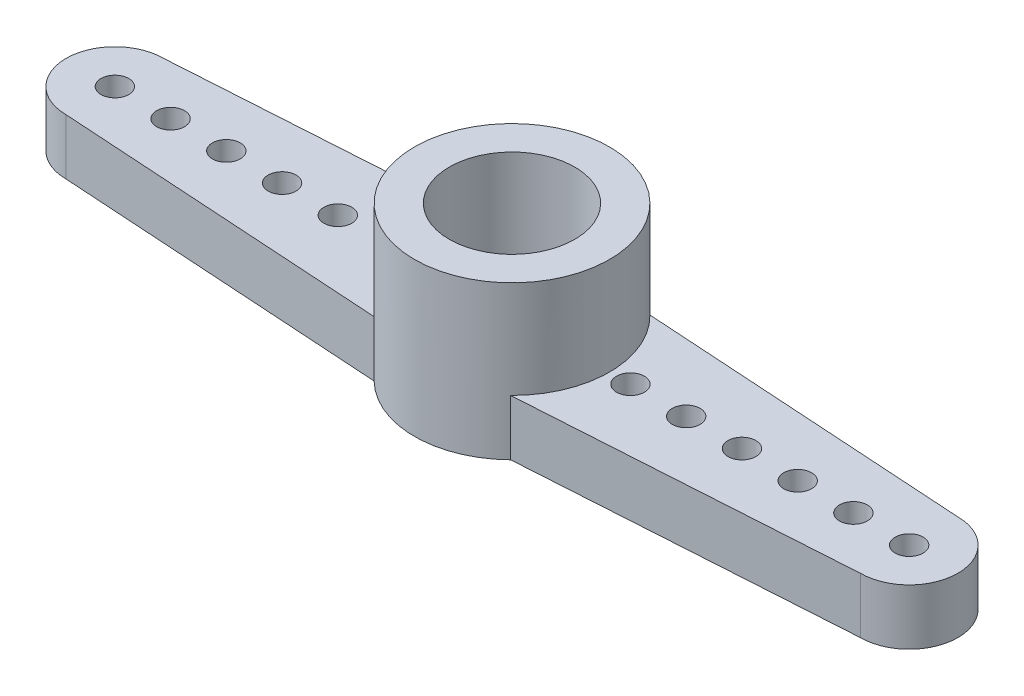
ISO-10303-21;
HEADER;
FILE_DESCRIPTION(('STEP AP214'),'2;1');
FILE_NAME('part.step','',(''),(''),'','','');
FILE_SCHEMA(('AUTOMOTIVE_DESIGN { 1 0 10303 214 1 1 1 1 }'));
ENDSEC;
DATA;
#1=APPLICATION_CONTEXT('core data for automotive mechanical design processes');
#2=APPLICATION_PROTOCOL_DEFINITION('international standard','automotive_design',2000,#1);
#3=PRODUCT_CONTEXT('',#1,'mechanical');
#4=PRODUCT('Part','Part','',(#3));
#5=PRODUCT_RELATED_PRODUCT_CATEGORY('part','',(#4));
#6=PRODUCT_DEFINITION_FORMATION('','',#4);
#7=PRODUCT_DEFINITION_CONTEXT('part definition',#1,'design');
#8=PRODUCT_DEFINITION('design','',#6,#7);
#9=PRODUCT_DEFINITION_SHAPE('','',#8);
#10=(LENGTH_UNIT() NAMED_UNIT(*) SI_UNIT(.MILLI.,.METRE.));
#11=(NAMED_UNIT(*) PLANE_ANGLE_UNIT() SI_UNIT($,.RADIAN.));
#12=(NAMED_UNIT(*) SI_UNIT($,.STERADIAN.) SOLID_ANGLE_UNIT());
#13=UNCERTAINTY_MEASURE_WITH_UNIT(LENGTH_MEASURE(1.E-05),#10,'distance_accuracy_value','');
#14=(GEOMETRIC_REPRESENTATION_CONTEXT(3) GLOBAL_UNCERTAINTY_ASSIGNED_CONTEXT((#13)) GLOBAL_UNIT_ASSIGNED_CONTEXT((#10,
#11,#12)) REPRESENTATION_CONTEXT('',''));
#15=CARTESIAN_POINT('',(0.,0.,0.));
#16=DIRECTION('',(0.,0.,1.));
#17=DIRECTION('',(1.,0.,0.));
#18=AXIS2_PLACEMENT_3D('',#15,#16,#17);
#19=CARTESIAN_POINT('',(14.25,0.,0.));
#20=DIRECTION('',(0.,1.,0.));
#21=DIRECTION('',(0.,0.,1.));
#22=AXIS2_PLACEMENT_3D('',#19,#20,#21);
#23=PLANE('',#22);
#24=CARTESIAN_POINT('',(12.25,0.,0.));
#25=DIRECTION('',(0.,-1.,0.));
#26=DIRECTION('',(0.,0.,-1.));
#27=AXIS2_PLACEMENT_3D('',#24,#25,#26);
#28=CIRCLE('',#27,0.500000000000001);
#29=CARTESIAN_POINT('',(12.25,0.,-0.500000000000015));
#30=VERTEX_POINT('',#29);
#31=EDGE_CURVE('E269',#30,#30,#28,.T.);
#32=ORIENTED_EDGE('',*,*,#31,.F.);
#33=EDGE_LOOP('',(#32));
#34=FACE_BOUND('',#33,.T.);
#35=CARTESIAN_POINT('',(10.25,0.,0.));
#36=DIRECTION('',(0.,-1.,0.));
#37=DIRECTION('',(0.,0.,-1.));
#38=AXIS2_PLACEMENT_3D('',#35,#36,#37);
#39=CIRCLE('',#38,0.500000000000001);
#40=CARTESIAN_POINT('',(10.25,0.,-0.500000000000029));
#41=VERTEX_POINT('',#40);
#42=EDGE_CURVE('E272',#41,#41,#39,.T.);
#43=ORIENTED_EDGE('',*,*,#42,.F.);
#44=EDGE_LOOP('',(#43));
#45=FACE_BOUND('',#44,.T.);
#46=CARTESIAN_POINT('',(8.25,0.,0.));
#47=DIRECTION('',(0.,-1.,0.));
#48=DIRECTION('',(0.,0.,-1.));
#49=AXIS2_PLACEMENT_3D('',#46,#47,#48);
#50=CIRCLE('',#49,0.500000000000001);
#51=CARTESIAN_POINT('',(8.25,0.,-0.500000000000043));
#52=VERTEX_POINT('',#51);
#53=EDGE_CURVE('E261',#52,#52,#50,.T.);
#54=ORIENTED_EDGE('',*,*,#53,.F.);
#55=EDGE_LOOP('',(#54));
#56=FACE_BOUND('',#55,.T.);
#57=CARTESIAN_POINT('',(14.25,0.,0.));
#58=DIRECTION('',(0.,-1.,0.));
#59=DIRECTION('',(0.,0.,-1.));
#60=AXIS2_PLACEMENT_3D('',#57,#58,#59);
#61=CIRCLE('',#60,0.500000000000001);
#62=CARTESIAN_POINT('',(14.25,0.,-0.500000000000001));
#63=VERTEX_POINT('',#62);
#64=EDGE_CURVE('E247',#63,#63,#61,.T.);
#65=ORIENTED_EDGE('',*,*,#64,.F.);
#66=EDGE_LOOP('',(#65));
#67=FACE_BOUND('',#66,.T.);
#68=CARTESIAN_POINT('',(4.25,0.,0.));
#69=DIRECTION('',(0.,-1.,0.));
#70=DIRECTION('',(0.,0.,-1.));
#71=AXIS2_PLACEMENT_3D('',#68,#69,#70);
#72=CIRCLE('',#71,0.500000000000001);
#73=CARTESIAN_POINT('',(4.25,0.,-0.500000000000071));
#74=VERTEX_POINT('',#73);
#75=EDGE_CURVE('E260',#74,#74,#72,.T.);
#76=ORIENTED_EDGE('',*,*,#75,.F.);
#77=EDGE_LOOP('',(#76));
#78=FACE_BOUND('',#77,.T.);
#79=CARTESIAN_POINT('',(6.25,0.,0.));
#80=DIRECTION('',(0.,-1.,0.));
#81=DIRECTION('',(0.,0.,-1.));
#82=AXIS2_PLACEMENT_3D('',#79,#80,#81);
#83=CIRCLE('',#82,0.500000000000001);
#84=CARTESIAN_POINT('',(6.25,0.,-0.500000000000057));
#85=VERTEX_POINT('',#84);
#86=EDGE_CURVE('E257',#85,#85,#83,.T.);
#87=ORIENTED_EDGE('',*,*,#86,.F.);
#88=EDGE_LOOP('',(#87));
#89=FACE_BOUND('',#88,.T.);
#90=CARTESIAN_POINT('',(0.,0.,0.));
#91=DIRECTION('',(0.,-1.,0.));
#92=DIRECTION('',(0.,0.,-1.));
#93=AXIS2_PLACEMENT_3D('',#90,#91,#92);
#94=CIRCLE('',#93,2.5);
#95=CARTESIAN_POINT('',(0.,0.,-2.5));
#96=VERTEX_POINT('',#95);
#97=EDGE_CURVE('E201',#96,#96,#94,.T.);
#98=ORIENTED_EDGE('',*,*,#97,.F.);
#99=EDGE_LOOP('',(#98));
#100=FACE_BOUND('',#99,.T.);
#101=CARTESIAN_POINT('',(14.25,0.,0.));
#102=DIRECTION('',(0.,1.,0.));
#103=DIRECTION('',(0.,0.,1.));
#104=AXIS2_PLACEMENT_3D('',#101,#102,#103);
#105=CIRCLE('',#104,1.75);
#106=CARTESIAN_POINT('',(14.25,0.,1.75));
#107=VERTEX_POINT('',#106);
#108=CARTESIAN_POINT('',(14.25,0.,-1.75));
#109=VERTEX_POINT('',#108);
#110=EDGE_CURVE('E146',#107,#109,#105,.T.);
#111=ORIENTED_EDGE('',*,*,#110,.F.);
#112=DIRECTION('',(0.997986379341568,0.,-0.0634285948820241));
#113=VECTOR('',#112,1.);
#114=CARTESIAN_POINT('',(14.25,0.,1.75));
#115=LINE('',#114,#113);
#116=CARTESIAN_POINT('',(2.44948974278318,0.,2.5));
#117=VERTEX_POINT('',#116);
#118=EDGE_CURVE('E97',#117,#107,#115,.T.);
#119=ORIENTED_EDGE('',*,*,#118,.F.);
#120=CARTESIAN_POINT('',(0.,0.,0.));
#121=DIRECTION('',(0.,1.,0.));
#122=DIRECTION('',(0.,0.,1.));
#123=AXIS2_PLACEMENT_3D('',#120,#121,#122);
#124=CIRCLE('',#123,3.5);
#125=CARTESIAN_POINT('',(-2.44948974278318,0.,2.5));
#126=VERTEX_POINT('',#125);
#127=EDGE_CURVE('E91',#126,#117,#124,.T.);
#128=ORIENTED_EDGE('',*,*,#127,.F.);
#129=DIRECTION('',(0.997986379341568,0.,0.0634285948820241));
#130=VECTOR('',#129,1.);
#131=CARTESIAN_POINT('',(-14.25,0.,1.75));
#132=LINE('',#131,#130);
#133=CARTESIAN_POINT('',(-14.25,0.,1.75));
#134=VERTEX_POINT('',#133);
#135=EDGE_CURVE('E157',#134,#126,#132,.T.);
#136=ORIENTED_EDGE('',*,*,#135,.F.);
#137=CARTESIAN_POINT('',(-14.25,0.,0.));
#138=DIRECTION('',(0.,1.,0.));
#139=DIRECTION('',(0.,0.,1.));
#140=AXIS2_PLACEMENT_3D('',#137,#138,#139);
#141=CIRCLE('',#140,1.75);
#142=CARTESIAN_POINT('',(-14.25,0.,-1.75));
#143=VERTEX_POINT('',#142);
#144=EDGE_CURVE('E134',#143,#134,#141,.T.);
#145=ORIENTED_EDGE('',*,*,#144,.F.);
#146=DIRECTION('',(-0.997986379341568,0.,0.0634285948820241));
#147=VECTOR('',#146,1.);
#148=CARTESIAN_POINT('',(-14.25,0.,-1.75));
#149=LINE('',#148,#147);
#150=CARTESIAN_POINT('',(-2.44948974278318,0.,-2.5));
#151=VERTEX_POINT('',#150);
#152=EDGE_CURVE('E154',#151,#143,#149,.T.);
#153=ORIENTED_EDGE('',*,*,#152,.F.);
#154=CARTESIAN_POINT('',(0.,0.,0.));
#155=DIRECTION('',(0.,1.,0.));
#156=DIRECTION('',(0.,0.,1.));
#157=AXIS2_PLACEMENT_3D('',#154,#155,#156);
#158=CIRCLE('',#157,3.5);
#159=CARTESIAN_POINT('',(2.44948974278318,0.,-2.5));
#160=VERTEX_POINT('',#159);
#161=EDGE_CURVE('E152',#160,#151,#158,.T.);
#162=ORIENTED_EDGE('',*,*,#161,.F.);
#163=DIRECTION('',(-0.997986379341568,0.,-0.0634285948820241));
#164=VECTOR('',#163,1.);
#165=CARTESIAN_POINT('',(14.25,0.,-1.75));
#166=LINE('',#165,#164);
#167=EDGE_CURVE('E149',#109,#160,#166,.T.);
#168=ORIENTED_EDGE('',*,*,#167,.F.);
#169=EDGE_LOOP('',(#111,#119,#128,#136,#145,#153,#162,#168));
#170=FACE_BOUND('',#169,.T.);
#171=CARTESIAN_POINT('',(-4.25,0.,0.));
#172=DIRECTION('',(0.,1.,0.));
#173=DIRECTION('',(0.,0.,1.));
#174=AXIS2_PLACEMENT_3D('',#171,#172,#173);
#175=CIRCLE('',#174,0.500000000000001);
#176=CARTESIAN_POINT('',(-4.25,0.,0.499999999999931));
#177=VERTEX_POINT('',#176);
#178=EDGE_CURVE('E264',#177,#177,#175,.T.);
#179=ORIENTED_EDGE('',*,*,#178,.T.);
#180=EDGE_LOOP('',(#179));
#181=FACE_BOUND('',#180,.T.);
#182=CARTESIAN_POINT('',(-6.25,0.,0.));
#183=DIRECTION('',(0.,1.,0.));
#184=DIRECTION('',(0.,0.,1.));
#185=AXIS2_PLACEMENT_3D('',#182,#183,#184);
#186=CIRCLE('',#185,0.500000000000001);
#187=CARTESIAN_POINT('',(-6.25,0.,0.499999999999945));
#188=VERTEX_POINT('',#187);
#189=EDGE_CURVE('E254',#188,#188,#186,.T.);
#190=ORIENTED_EDGE('',*,*,#189,.T.);
#191=EDGE_LOOP('',(#190));
#192=FACE_BOUND('',#191,.T.);
#193=CARTESIAN_POINT('',(-12.25,0.,0.));
#194=DIRECTION('',(0.,1.,0.));
#195=DIRECTION('',(0.,0.,1.));
#196=AXIS2_PLACEMENT_3D('',#193,#194,#195);
#197=CIRCLE('',#196,0.500000000000001);
#198=CARTESIAN_POINT('',(-12.25,0.,0.499999999999987));
#199=VERTEX_POINT('',#198);
#200=EDGE_CURVE('E244',#199,#199,#197,.T.);
#201=ORIENTED_EDGE('',*,*,#200,.T.);
#202=EDGE_LOOP('',(#201));
#203=FACE_BOUND('',#202,.T.);
#204=CARTESIAN_POINT('',(-10.25,0.,0.));
#205=DIRECTION('',(0.,1.,0.));
#206=DIRECTION('',(0.,0.,1.));
#207=AXIS2_PLACEMENT_3D('',#204,#205,#206);
#208=CIRCLE('',#207,0.500000000000001);
#209=CARTESIAN_POINT('',(-10.25,0.,0.499999999999973));
#210=VERTEX_POINT('',#209);
#211=EDGE_CURVE('E248',#210,#210,#208,.T.);
#212=ORIENTED_EDGE('',*,*,#211,.T.);
#213=EDGE_LOOP('',(#212));
#214=FACE_BOUND('',#213,.T.);
#215=CARTESIAN_POINT('',(-8.25,0.,0.));
#216=DIRECTION('',(0.,1.,0.));
#217=DIRECTION('',(0.,0.,1.));
#218=AXIS2_PLACEMENT_3D('',#215,#216,#217);
#219=CIRCLE('',#218,0.500000000000001);
#220=CARTESIAN_POINT('',(-8.25,0.,0.499999999999959));
#221=VERTEX_POINT('',#220);
#222=EDGE_CURVE('E251',#221,#221,#219,.T.);
#223=ORIENTED_EDGE('',*,*,#222,.T.);
#224=EDGE_LOOP('',(#223));
#225=FACE_BOUND('',#224,.T.);
#226=CARTESIAN_POINT('',(-14.25,0.,0.));
#227=DIRECTION('',(0.,-1.,0.));
#228=DIRECTION('',(0.,0.,-1.));
#229=AXIS2_PLACEMENT_3D('',#226,#227,#228);
#230=CIRCLE('',#229,0.500000000000001);
#231=CARTESIAN_POINT('',(-14.25,0.,-0.500000000000001));
#232=VERTEX_POINT('',#231);
#233=EDGE_CURVE('E243',#232,#232,#230,.F.);
#234=ORIENTED_EDGE('',*,*,#233,.T.);
#235=EDGE_LOOP('',(#234));
#236=FACE_BOUND('',#235,.T.);
#237=ADVANCED_FACE('F40',(#34,#45,#56,#67,#78,#89,#100,#170,#181,#192,#203,#214,#225,#236),#23,.F.);
#238=CARTESIAN_POINT('',(0.,-3.,0.));
#239=DIRECTION('',(0.,1.,0.));
#240=DIRECTION('',(0.,0.,1.));
#241=AXIS2_PLACEMENT_3D('',#238,#239,#240);
#242=CYLINDRICAL_SURFACE('',#241,1.25);
#243=CARTESIAN_POINT('',(0.,2.,0.));
#244=DIRECTION('',(0.,1.,0.));
#245=DIRECTION('',(0.,0.,1.));
#246=AXIS2_PLACEMENT_3D('',#243,#244,#245);
#247=CIRCLE('',#246,1.25);
#248=CARTESIAN_POINT('',(0.,2.,1.25));
#249=VERTEX_POINT('',#248);
#250=EDGE_CURVE('E196',#249,#249,#247,.T.);
#251=ORIENTED_EDGE('',*,*,#250,.T.);
#252=EDGE_LOOP('',(#251));
#253=FACE_BOUND('',#252,.T.);
#254=CARTESIAN_POINT('',(0.,1.,0.));
#255=DIRECTION('',(0.,-1.,0.));
#256=DIRECTION('',(0.,0.,-1.));
#257=AXIS2_PLACEMENT_3D('',#254,#255,#256);
#258=CIRCLE('',#257,1.25);
#259=CARTESIAN_POINT('',(0.,1.,-1.25));
#260=VERTEX_POINT('',#259);
#261=EDGE_CURVE('E44',#260,#260,#258,.F.);
#262=ORIENTED_EDGE('',*,*,#261,.F.);
#263=EDGE_LOOP('',(#262));
#264=FACE_BOUND('',#263,.T.);
#265=ADVANCED_FACE('F295',(#253,#264),#242,.F.);
#266=CARTESIAN_POINT('',(14.25,2.,0.));
#267=DIRECTION('',(0.,1.,0.));
#268=DIRECTION('',(0.,0.,1.));
#269=AXIS2_PLACEMENT_3D('',#266,#267,#268);
#270=PLANE('',#269);
#271=CARTESIAN_POINT('',(12.25,2.,0.));
#272=DIRECTION('',(0.,1.,0.));
#273=DIRECTION('',(0.,0.,1.));
#274=AXIS2_PLACEMENT_3D('',#271,#272,#273);
#275=CIRCLE('',#274,0.500000000000001);
#276=CARTESIAN_POINT('',(12.25,2.,0.499999999999987));
#277=VERTEX_POINT('',#276);
#278=EDGE_CURVE('E210',#277,#277,#275,.T.);
#279=ORIENTED_EDGE('',*,*,#278,.F.);
#280=EDGE_LOOP('',(#279));
#281=FACE_BOUND('',#280,.T.);
#282=CARTESIAN_POINT('',(10.25,2.,0.));
#283=DIRECTION('',(0.,1.,0.));
#284=DIRECTION('',(0.,0.,1.));
#285=AXIS2_PLACEMENT_3D('',#282,#283,#284);
#286=CIRCLE('',#285,0.500000000000001);
#287=CARTESIAN_POINT('',(10.25,2.,0.499999999999973));
#288=VERTEX_POINT('',#287);
#289=EDGE_CURVE('E213',#288,#288,#286,.T.);
#290=ORIENTED_EDGE('',*,*,#289,.F.);
#291=EDGE_LOOP('',(#290));
#292=FACE_BOUND('',#291,.T.);
#293=CARTESIAN_POINT('',(8.25,2.,0.));
#294=DIRECTION('',(0.,1.,0.));
#295=DIRECTION('',(0.,0.,1.));
#296=AXIS2_PLACEMENT_3D('',#293,#294,#295);
#297=CIRCLE('',#296,0.500000000000001);
#298=CARTESIAN_POINT('',(8.25,2.,0.499999999999959));
#299=VERTEX_POINT('',#298);
#300=EDGE_CURVE('E216',#299,#299,#297,.T.);
#301=ORIENTED_EDGE('',*,*,#300,.F.);
#302=EDGE_LOOP('',(#301));
#303=FACE_BOUND('',#302,.T.);
#304=CARTESIAN_POINT('',(14.25,2.,0.));
#305=DIRECTION('',(0.,1.,0.));
#306=DIRECTION('',(0.,0.,1.));
#307=AXIS2_PLACEMENT_3D('',#304,#305,#306);
#308=CIRCLE('',#307,0.500000000000001);
#309=CARTESIAN_POINT('',(14.25,2.,0.500000000000001));
#310=VERTEX_POINT('',#309);
#311=EDGE_CURVE('E228',#310,#310,#308,.T.);
#312=ORIENTED_EDGE('',*,*,#311,.F.);
#313=EDGE_LOOP('',(#312));
#314=FACE_BOUND('',#313,.T.);
#315=CARTESIAN_POINT('',(4.25,2.,0.));
#316=DIRECTION('',(0.,1.,0.));
#317=DIRECTION('',(0.,0.,1.));
#318=AXIS2_PLACEMENT_3D('',#315,#316,#317);
#319=CIRCLE('',#318,0.500000000000001);
#320=CARTESIAN_POINT('',(4.25,2.,0.499999999999931));
#321=VERTEX_POINT('',#320);
#322=EDGE_CURVE('E237',#321,#321,#319,.T.);
#323=ORIENTED_EDGE('',*,*,#322,.F.);
#324=EDGE_LOOP('',(#323));
#325=FACE_BOUND('',#324,.T.);
#326=CARTESIAN_POINT('',(6.25,2.,0.));
#327=DIRECTION('',(0.,1.,0.));
#328=DIRECTION('',(0.,0.,1.));
#329=AXIS2_PLACEMENT_3D('',#326,#327,#328);
#330=CIRCLE('',#329,0.500000000000001);
#331=CARTESIAN_POINT('',(6.25,2.,0.499999999999945));
#332=VERTEX_POINT('',#331);
#333=EDGE_CURVE('E240',#332,#332,#330,.T.);
#334=ORIENTED_EDGE('',*,*,#333,.F.);
#335=EDGE_LOOP('',(#334));
#336=FACE_BOUND('',#335,.T.);
#337=CARTESIAN_POINT('',(0.,2.,0.));
#338=DIRECTION('',(0.,1.,0.));
#339=DIRECTION('',(0.,0.,1.));
#340=AXIS2_PLACEMENT_3D('',#337,#338,#339);
#341=CIRCLE('',#340,3.5);
#342=CARTESIAN_POINT('',(2.44948974278318,2.,2.5));
#343=VERTEX_POINT('',#342);
#344=CARTESIAN_POINT('',(2.44948974278318,2.,-2.5));
#345=VERTEX_POINT('',#344);
#346=EDGE_CURVE('E52',#343,#345,#341,.T.);
#347=ORIENTED_EDGE('',*,*,#346,.F.);
#348=DIRECTION('',(0.997986379341568,0.,-0.0634285948820241));
#349=VECTOR('',#348,1.);
#350=CARTESIAN_POINT('',(14.25,2.,1.75));
#351=LINE('',#350,#349);
#352=CARTESIAN_POINT('',(14.25,2.,1.75));
#353=VERTEX_POINT('',#352);
#354=EDGE_CURVE('E60',#343,#353,#351,.T.);
#355=ORIENTED_EDGE('',*,*,#354,.T.);
#356=CARTESIAN_POINT('',(14.25,2.,0.));
#357=DIRECTION('',(0.,1.,0.));
#358=DIRECTION('',(0.,0.,1.));
#359=AXIS2_PLACEMENT_3D('',#356,#357,#358);
#360=CIRCLE('',#359,1.75);
#361=CARTESIAN_POINT('',(14.25,2.,-1.75));
#362=VERTEX_POINT('',#361);
#363=EDGE_CURVE('E161',#353,#362,#360,.T.);
#364=ORIENTED_EDGE('',*,*,#363,.T.);
#365=DIRECTION('',(-0.997986379341568,0.,-0.0634285948820241));
#366=VECTOR('',#365,1.);
#367=CARTESIAN_POINT('',(14.25,2.,-1.75));
#368=LINE('',#367,#366);
#369=EDGE_CURVE('E106',#362,#345,#368,.T.);
#370=ORIENTED_EDGE('',*,*,#369,.T.);
#371=EDGE_LOOP('',(#347,#355,#364,#370));
#372=FACE_BOUND('',#371,.T.);
#373=ADVANCED_FACE('F301',(#281,#292,#303,#314,#325,#336,#372),#270,.T.);
#374=CARTESIAN_POINT('',(14.25,2.,0.));
#375=DIRECTION('',(0.,-1.,0.));
#376=DIRECTION('',(0.,0.,-1.));
#377=AXIS2_PLACEMENT_3D('',#374,#375,#376);
#378=CYLINDRICAL_SURFACE('',#377,1.75);
#379=ORIENTED_EDGE('',*,*,#110,.T.);
#380=DIRECTION('',(0.,-1.,0.));
#381=VECTOR('',#380,1.);
#382=CARTESIAN_POINT('',(14.25,2.,-1.75));
#383=LINE('',#382,#381);
#384=EDGE_CURVE('E50',#362,#109,#383,.T.);
#385=ORIENTED_EDGE('',*,*,#384,.F.);
#386=ORIENTED_EDGE('',*,*,#363,.F.);
#387=DIRECTION('',(0.,-1.,0.));
#388=VECTOR('',#387,1.);
#389=CARTESIAN_POINT('',(14.25,2.,1.75));
#390=LINE('',#389,#388);
#391=EDGE_CURVE('E142',#353,#107,#390,.T.);
#392=ORIENTED_EDGE('',*,*,#391,.T.);
#393=EDGE_LOOP('',(#379,#385,#386,#392));
#394=FACE_BOUND('',#393,.T.);
#395=ADVANCED_FACE('F42',(#394),#378,.T.);
#396=CARTESIAN_POINT('',(14.25,2.,-1.75));
#397=DIRECTION('',(-0.0634285948820241,0.,0.997986379341568));
#398=DIRECTION('',(0.997986379341568,0.,0.0634285948820241));
#399=AXIS2_PLACEMENT_3D('',#396,#397,#398);
#400=PLANE('',#399);
#401=ORIENTED_EDGE('',*,*,#167,.T.);
#402=DIRECTION('',(0.,-1.,0.));
#403=VECTOR('',#402,1.);
#404=CARTESIAN_POINT('',(2.44948974278318,2.,-2.5));
#405=LINE('',#404,#403);
#406=EDGE_CURVE('E170',#345,#160,#405,.T.);
#407=ORIENTED_EDGE('',*,*,#406,.F.);
#408=ORIENTED_EDGE('',*,*,#369,.F.);
#409=ORIENTED_EDGE('',*,*,#384,.T.);
#410=EDGE_LOOP('',(#401,#407,#408,#409));
#411=FACE_BOUND('',#410,.T.);
#412=ADVANCED_FACE('F173',(#411),#400,.F.);
#413=CARTESIAN_POINT('',(-14.25,2.,-1.75));
#414=DIRECTION('',(0.0634285948820241,0.,0.997986379341568));
#415=DIRECTION('',(0.997986379341568,0.,-0.0634285948820241));
#416=AXIS2_PLACEMENT_3D('',#413,#414,#415);
#417=PLANE('',#416);
#418=ORIENTED_EDGE('',*,*,#152,.T.);
#419=DIRECTION('',(0.,-1.,0.));
#420=VECTOR('',#419,1.);
#421=CARTESIAN_POINT('',(-14.25,2.,-1.75));
#422=LINE('',#421,#420);
#423=CARTESIAN_POINT('',(-14.25,2.,-1.75));
#424=VERTEX_POINT('',#423);
#425=EDGE_CURVE('E137',#424,#143,#422,.T.);
#426=ORIENTED_EDGE('',*,*,#425,.F.);
#427=DIRECTION('',(-0.997986379341568,0.,0.0634285948820241));
#428=VECTOR('',#427,1.);
#429=CARTESIAN_POINT('',(-14.25,2.,-1.75));
#430=LINE('',#429,#428);
#431=CARTESIAN_POINT('',(-2.44948974278318,2.,-2.5));
#432=VERTEX_POINT('',#431);
#433=EDGE_CURVE('E125',#432,#424,#430,.T.);
#434=ORIENTED_EDGE('',*,*,#433,.F.);
#435=DIRECTION('',(0.,-1.,0.));
#436=VECTOR('',#435,1.);
#437=CARTESIAN_POINT('',(-2.44948974278318,2.,-2.5));
#438=LINE('',#437,#436);
#439=EDGE_CURVE('E167',#432,#151,#438,.T.);
#440=ORIENTED_EDGE('',*,*,#439,.T.);
#441=EDGE_LOOP('',(#418,#426,#434,#440));
#442=FACE_BOUND('',#441,.T.);
#443=ADVANCED_FACE('F186',(#442),#417,.F.);
#444=CARTESIAN_POINT('',(-14.25,2.,0.));
#445=DIRECTION('',(0.,-1.,0.));
#446=DIRECTION('',(0.,0.,-1.));
#447=AXIS2_PLACEMENT_3D('',#444,#445,#446);
#448=CYLINDRICAL_SURFACE('',#447,1.75);
#449=ORIENTED_EDGE('',*,*,#144,.T.);
#450=DIRECTION('',(0.,-1.,0.));
#451=VECTOR('',#450,1.);
#452=CARTESIAN_POINT('',(-14.25,2.,1.75));
#453=LINE('',#452,#451);
#454=CARTESIAN_POINT('',(-14.25,2.,1.75));
#455=VERTEX_POINT('',#454);
#456=EDGE_CURVE('E131',#455,#134,#453,.T.);
#457=ORIENTED_EDGE('',*,*,#456,.F.);
#458=CARTESIAN_POINT('',(-14.25,2.,0.));
#459=DIRECTION('',(0.,1.,0.));
#460=DIRECTION('',(0.,0.,1.));
#461=AXIS2_PLACEMENT_3D('',#458,#459,#460);
#462=CIRCLE('',#461,1.75);
#463=EDGE_CURVE('E118',#424,#455,#462,.T.);
#464=ORIENTED_EDGE('',*,*,#463,.F.);
#465=ORIENTED_EDGE('',*,*,#425,.T.);
#466=EDGE_LOOP('',(#449,#457,#464,#465));
#467=FACE_BOUND('',#466,.T.);
#468=ADVANCED_FACE('F132',(#467),#448,.T.);
#469=CARTESIAN_POINT('',(-14.25,2.,1.75));
#470=DIRECTION('',(0.0634285948820241,0.,-0.997986379341568));
#471=DIRECTION('',(-0.997986379341568,0.,-0.0634285948820241));
#472=AXIS2_PLACEMENT_3D('',#469,#470,#471);
#473=PLANE('',#472);
#474=ORIENTED_EDGE('',*,*,#135,.T.);
#475=DIRECTION('',(0.,-1.,0.));
#476=VECTOR('',#475,1.);
#477=CARTESIAN_POINT('',(-2.44948974278318,2.,2.5));
#478=LINE('',#477,#476);
#479=CARTESIAN_POINT('',(-2.44948974278318,2.,2.5));
#480=VERTEX_POINT('',#479);
#481=EDGE_CURVE('E138',#480,#126,#478,.T.);
#482=ORIENTED_EDGE('',*,*,#481,.F.);
#483=DIRECTION('',(0.997986379341568,0.,0.0634285948820241));
#484=VECTOR('',#483,1.);
#485=CARTESIAN_POINT('',(-14.25,2.,1.75));
#486=LINE('',#485,#484);
#487=EDGE_CURVE('E122',#455,#480,#486,.T.);
#488=ORIENTED_EDGE('',*,*,#487,.F.);
#489=ORIENTED_EDGE('',*,*,#456,.T.);
#490=EDGE_LOOP('',(#474,#482,#488,#489));
#491=FACE_BOUND('',#490,.T.);
#492=ADVANCED_FACE('F140',(#491),#473,.F.);
#493=CARTESIAN_POINT('',(0.,2.,0.));
#494=DIRECTION('',(0.,-1.,0.));
#495=DIRECTION('',(0.,0.,-1.));
#496=AXIS2_PLACEMENT_3D('',#493,#494,#495);
#497=CYLINDRICAL_SURFACE('',#496,3.5);
#498=ORIENTED_EDGE('',*,*,#127,.T.);
#499=DIRECTION('',(0.,-1.,0.));
#500=VECTOR('',#499,1.);
#501=CARTESIAN_POINT('',(2.44948974278318,2.,2.5));
#502=LINE('',#501,#500);
#503=EDGE_CURVE('E163',#343,#117,#502,.T.);
#504=ORIENTED_EDGE('',*,*,#503,.F.);
#505=ORIENTED_EDGE('',*,*,#346,.T.);
#506=ORIENTED_EDGE('',*,*,#406,.T.);
#507=ORIENTED_EDGE('',*,*,#161,.T.);
#508=ORIENTED_EDGE('',*,*,#439,.F.);
#509=EDGE_CURVE('E11',#432,#480,#341,.T.);
#510=ORIENTED_EDGE('',*,*,#509,.T.);
#511=ORIENTED_EDGE('',*,*,#481,.T.);
#512=EDGE_LOOP('',(#498,#504,#505,#506,#507,#508,#510,#511));
#513=FACE_BOUND('',#512,.T.);
#514=CARTESIAN_POINT('',(0.,5.5,0.));
#515=DIRECTION('',(0.,1.,0.));
#516=DIRECTION('',(0.,0.,1.));
#517=AXIS2_PLACEMENT_3D('',#514,#515,#516);
#518=CIRCLE('',#517,3.5);
#519=CARTESIAN_POINT('',(0.,5.5,3.5));
#520=VERTEX_POINT('',#519);
#521=EDGE_CURVE('E150',#520,#520,#518,.T.);
#522=ORIENTED_EDGE('',*,*,#521,.F.);
#523=EDGE_LOOP('',(#522));
#524=FACE_BOUND('',#523,.T.);
#525=ADVANCED_FACE('F182',(#513,#524),#497,.T.);
#526=CARTESIAN_POINT('',(14.25,2.,1.75));
#527=DIRECTION('',(-0.0634285948820241,0.,-0.997986379341568));
#528=DIRECTION('',(-0.997986379341568,0.,0.0634285948820241));
#529=AXIS2_PLACEMENT_3D('',#526,#527,#528);
#530=PLANE('',#529);
#531=ORIENTED_EDGE('',*,*,#118,.T.);
#532=ORIENTED_EDGE('',*,*,#391,.F.);
#533=ORIENTED_EDGE('',*,*,#354,.F.);
#534=ORIENTED_EDGE('',*,*,#503,.T.);
#535=EDGE_LOOP('',(#531,#532,#533,#534));
#536=FACE_BOUND('',#535,.T.);
#537=ADVANCED_FACE('F309',(#536),#530,.F.);
#538=CARTESIAN_POINT('',(-14.25,2.,0.));
#539=DIRECTION('',(0.,1.,0.));
#540=DIRECTION('',(0.,0.,1.));
#541=AXIS2_PLACEMENT_3D('',#538,#539,#540);
#542=CIRCLE('',#541,0.500000000000001);
#543=CARTESIAN_POINT('',(-14.25,2.,0.500000000000001));
#544=VERTEX_POINT('',#543);
#545=EDGE_CURVE('E205',#544,#544,#542,.F.);
#546=ORIENTED_EDGE('',*,*,#545,.T.);
#547=EDGE_LOOP('',(#546));
#548=FACE_BOUND('',#547,.T.);
#549=CARTESIAN_POINT('',(-8.25,2.,0.));
#550=DIRECTION('',(0.,1.,0.));
#551=DIRECTION('',(0.,0.,1.));
#552=AXIS2_PLACEMENT_3D('',#549,#550,#551);
#553=CIRCLE('',#552,0.500000000000001);
#554=CARTESIAN_POINT('',(-8.25,2.,0.499999999999959));
#555=VERTEX_POINT('',#554);
#556=EDGE_CURVE('E219',#555,#555,#553,.F.);
#557=ORIENTED_EDGE('',*,*,#556,.T.);
#558=EDGE_LOOP('',(#557));
#559=FACE_BOUND('',#558,.T.);
#560=CARTESIAN_POINT('',(-10.25,2.,0.));
#561=DIRECTION('',(0.,1.,0.));
#562=DIRECTION('',(0.,0.,1.));
#563=AXIS2_PLACEMENT_3D('',#560,#561,#562);
#564=CIRCLE('',#563,0.500000000000001);
#565=CARTESIAN_POINT('',(-10.25,2.,0.499999999999973));
#566=VERTEX_POINT('',#565);
#567=EDGE_CURVE('E222',#566,#566,#564,.F.);
#568=ORIENTED_EDGE('',*,*,#567,.T.);
#569=EDGE_LOOP('',(#568));
#570=FACE_BOUND('',#569,.T.);
#571=CARTESIAN_POINT('',(-12.25,2.,0.));
#572=DIRECTION('',(0.,1.,0.));
#573=DIRECTION('',(0.,0.,1.));
#574=AXIS2_PLACEMENT_3D('',#571,#572,#573);
#575=CIRCLE('',#574,0.500000000000001);
#576=CARTESIAN_POINT('',(-12.25,2.,0.499999999999987));
#577=VERTEX_POINT('',#576);
#578=EDGE_CURVE('E225',#577,#577,#575,.F.);
#579=ORIENTED_EDGE('',*,*,#578,.T.);
#580=EDGE_LOOP('',(#579));
#581=FACE_BOUND('',#580,.T.);
#582=CARTESIAN_POINT('',(-6.25,2.,0.));
#583=DIRECTION('',(0.,1.,0.));
#584=DIRECTION('',(0.,0.,1.));
#585=AXIS2_PLACEMENT_3D('',#582,#583,#584);
#586=CIRCLE('',#585,0.500000000000001);
#587=CARTESIAN_POINT('',(-6.25,2.,0.499999999999945));
#588=VERTEX_POINT('',#587);
#589=EDGE_CURVE('E231',#588,#588,#586,.F.);
#590=ORIENTED_EDGE('',*,*,#589,.T.);
#591=EDGE_LOOP('',(#590));
#592=FACE_BOUND('',#591,.T.);
#593=CARTESIAN_POINT('',(-4.25,2.,0.));
#594=DIRECTION('',(0.,1.,0.));
#595=DIRECTION('',(0.,0.,1.));
#596=AXIS2_PLACEMENT_3D('',#593,#594,#595);
#597=CIRCLE('',#596,0.500000000000001);
#598=CARTESIAN_POINT('',(-4.25,2.,0.499999999999931));
#599=VERTEX_POINT('',#598);
#600=EDGE_CURVE('E234',#599,#599,#597,.F.);
#601=ORIENTED_EDGE('',*,*,#600,.T.);
#602=EDGE_LOOP('',(#601));
#603=FACE_BOUND('',#602,.T.);
#604=ORIENTED_EDGE('',*,*,#509,.F.);
#605=ORIENTED_EDGE('',*,*,#433,.T.);
#606=ORIENTED_EDGE('',*,*,#463,.T.);
#607=ORIENTED_EDGE('',*,*,#487,.T.);
#608=EDGE_LOOP('',(#604,#605,#606,#607));
#609=FACE_BOUND('',#608,.T.);
#610=ADVANCED_FACE('F120',(#548,#559,#570,#581,#592,#603,#609),#270,.T.);
#611=CARTESIAN_POINT('',(0.,5.5,0.));
#612=DIRECTION('',(0.,1.,0.));
#613=DIRECTION('',(0.,0.,1.));
#614=AXIS2_PLACEMENT_3D('',#611,#612,#613);
#615=PLANE('',#614);
#616=ORIENTED_EDGE('',*,*,#521,.T.);
#617=EDGE_LOOP('',(#616));
#618=FACE_BOUND('',#617,.T.);
#619=CARTESIAN_POINT('',(0.,5.5,0.));
#620=DIRECTION('',(0.,1.,0.));
#621=DIRECTION('',(0.,0.,1.));
#622=AXIS2_PLACEMENT_3D('',#619,#620,#621);
#623=CIRCLE('',#622,2.25);
#624=CARTESIAN_POINT('',(0.,5.5,2.25));
#625=VERTEX_POINT('',#624);
#626=EDGE_CURVE('E190',#625,#625,#623,.T.);
#627=ORIENTED_EDGE('',*,*,#626,.F.);
#628=EDGE_LOOP('',(#627));
#629=FACE_BOUND('',#628,.T.);
#630=ADVANCED_FACE('F337',(#618,#629),#615,.T.);
#631=CARTESIAN_POINT('',(0.,5.5,0.));
#632=DIRECTION('',(0.,-1.,0.));
#633=DIRECTION('',(0.,0.,-1.));
#634=AXIS2_PLACEMENT_3D('',#631,#632,#633);
#635=CYLINDRICAL_SURFACE('',#634,2.25);
#636=ORIENTED_EDGE('',*,*,#626,.T.);
#637=EDGE_LOOP('',(#636));
#638=FACE_BOUND('',#637,.T.);
#639=CARTESIAN_POINT('',(0.,2.,0.));
#640=DIRECTION('',(0.,1.,0.));
#641=DIRECTION('',(0.,0.,1.));
#642=AXIS2_PLACEMENT_3D('',#639,#640,#641);
#643=CIRCLE('',#642,2.25);
#644=CARTESIAN_POINT('',(0.,2.,2.25));
#645=VERTEX_POINT('',#644);
#646=EDGE_CURVE('E193',#645,#645,#643,.T.);
#647=ORIENTED_EDGE('',*,*,#646,.F.);
#648=EDGE_LOOP('',(#647));
#649=FACE_BOUND('',#648,.T.);
#650=ADVANCED_FACE('F334',(#638,#649),#635,.F.);
#651=ORIENTED_EDGE('',*,*,#250,.F.);
#652=EDGE_LOOP('',(#651));
#653=FACE_BOUND('',#652,.T.);
#654=ORIENTED_EDGE('',*,*,#646,.T.);
#655=EDGE_LOOP('',(#654));
#656=FACE_BOUND('',#655,.T.);
#657=ADVANCED_FACE('F327',(#653,#656),#270,.T.);
#658=CARTESIAN_POINT('',(0.,1.,0.));
#659=DIRECTION('',(0.,-1.,0.));
#660=DIRECTION('',(0.,0.,-1.));
#661=AXIS2_PLACEMENT_3D('',#658,#659,#660);
#662=PLANE('',#661);
#663=CARTESIAN_POINT('',(0.,1.,0.));
#664=DIRECTION('',(0.,-1.,0.));
#665=DIRECTION('',(0.,0.,-1.));
#666=AXIS2_PLACEMENT_3D('',#663,#664,#665);
#667=CIRCLE('',#666,2.5);
#668=CARTESIAN_POINT('',(0.,1.,-2.5));
#669=VERTEX_POINT('',#668);
#670=EDGE_CURVE('E204',#669,#669,#667,.T.);
#671=ORIENTED_EDGE('',*,*,#670,.T.);
#672=EDGE_LOOP('',(#671));
#673=FACE_BOUND('',#672,.T.);
#674=ORIENTED_EDGE('',*,*,#261,.T.);
#675=EDGE_LOOP('',(#674));
#676=FACE_BOUND('',#675,.T.);
#677=ADVANCED_FACE('F333',(#673,#676),#662,.T.);
#678=CARTESIAN_POINT('',(0.,1.,0.));
#679=DIRECTION('',(0.,-1.,0.));
#680=DIRECTION('',(0.,0.,-1.));
#681=AXIS2_PLACEMENT_3D('',#678,#679,#680);
#682=CYLINDRICAL_SURFACE('',#681,2.5);
#683=ORIENTED_EDGE('',*,*,#670,.F.);
#684=EDGE_LOOP('',(#683));
#685=FACE_BOUND('',#684,.T.);
#686=ORIENTED_EDGE('',*,*,#97,.T.);
#687=EDGE_LOOP('',(#686));
#688=FACE_BOUND('',#687,.T.);
#689=ADVANCED_FACE('F395',(#685,#688),#682,.F.);
#690=CARTESIAN_POINT('',(6.25,5.,0.));
#691=DIRECTION('',(0.,-1.,0.));
#692=DIRECTION('',(0.,0.,-1.));
#693=AXIS2_PLACEMENT_3D('',#690,#691,#692);
#694=CYLINDRICAL_SURFACE('',#693,0.500000000000001);
#695=ORIENTED_EDGE('',*,*,#333,.T.);
#696=EDGE_LOOP('',(#695));
#697=FACE_BOUND('',#696,.T.);
#698=ORIENTED_EDGE('',*,*,#86,.T.);
#699=EDGE_LOOP('',(#698));
#700=FACE_BOUND('',#699,.T.);
#701=ADVANCED_FACE('F398',(#697,#700),#694,.F.);
#702=CARTESIAN_POINT('',(4.25,5.,0.));
#703=DIRECTION('',(0.,-1.,0.));
#704=DIRECTION('',(0.,0.,-1.));
#705=AXIS2_PLACEMENT_3D('',#702,#703,#704);
#706=CYLINDRICAL_SURFACE('',#705,0.500000000000001);
#707=ORIENTED_EDGE('',*,*,#322,.T.);
#708=EDGE_LOOP('',(#707));
#709=FACE_BOUND('',#708,.T.);
#710=ORIENTED_EDGE('',*,*,#75,.T.);
#711=EDGE_LOOP('',(#710));
#712=FACE_BOUND('',#711,.T.);
#713=ADVANCED_FACE('F358',(#709,#712),#706,.F.);
#714=CARTESIAN_POINT('',(-4.25,5.,0.));
#715=DIRECTION('',(0.,-1.,0.));
#716=DIRECTION('',(0.,0.,-1.));
#717=AXIS2_PLACEMENT_3D('',#714,#715,#716);
#718=CYLINDRICAL_SURFACE('',#717,0.500000000000001);
#719=ORIENTED_EDGE('',*,*,#600,.F.);
#720=EDGE_LOOP('',(#719));
#721=FACE_BOUND('',#720,.T.);
#722=ORIENTED_EDGE('',*,*,#178,.F.);
#723=EDGE_LOOP('',(#722));
#724=FACE_BOUND('',#723,.T.);
#725=ADVANCED_FACE('F354',(#721,#724),#718,.F.);
#726=CARTESIAN_POINT('',(-6.25,5.,0.));
#727=DIRECTION('',(0.,-1.,0.));
#728=DIRECTION('',(0.,0.,-1.));
#729=AXIS2_PLACEMENT_3D('',#726,#727,#728);
#730=CYLINDRICAL_SURFACE('',#729,0.500000000000001);
#731=ORIENTED_EDGE('',*,*,#589,.F.);
#732=EDGE_LOOP('',(#731));
#733=FACE_BOUND('',#732,.T.);
#734=ORIENTED_EDGE('',*,*,#189,.F.);
#735=EDGE_LOOP('',(#734));
#736=FACE_BOUND('',#735,.T.);
#737=ADVANCED_FACE('F357',(#733,#736),#730,.F.);
#738=CARTESIAN_POINT('',(14.25,5.,0.));
#739=DIRECTION('',(0.,-1.,0.));
#740=DIRECTION('',(0.,0.,-1.));
#741=AXIS2_PLACEMENT_3D('',#738,#739,#740);
#742=CYLINDRICAL_SURFACE('',#741,0.500000000000001);
#743=ORIENTED_EDGE('',*,*,#311,.T.);
#744=EDGE_LOOP('',(#743));
#745=FACE_BOUND('',#744,.T.);
#746=ORIENTED_EDGE('',*,*,#64,.T.);
#747=EDGE_LOOP('',(#746));
#748=FACE_BOUND('',#747,.T.);
#749=ADVANCED_FACE('F386',(#745,#748),#742,.F.);
#750=CARTESIAN_POINT('',(-12.25,5.,0.));
#751=DIRECTION('',(0.,-1.,0.));
#752=DIRECTION('',(0.,0.,-1.));
#753=AXIS2_PLACEMENT_3D('',#750,#751,#752);
#754=CYLINDRICAL_SURFACE('',#753,0.500000000000001);
#755=ORIENTED_EDGE('',*,*,#578,.F.);
#756=EDGE_LOOP('',(#755));
#757=FACE_BOUND('',#756,.T.);
#758=ORIENTED_EDGE('',*,*,#200,.F.);
#759=EDGE_LOOP('',(#758));
#760=FACE_BOUND('',#759,.T.);
#761=ADVANCED_FACE('F381',(#757,#760),#754,.F.);
#762=CARTESIAN_POINT('',(-10.25,5.,0.));
#763=DIRECTION('',(0.,-1.,0.));
#764=DIRECTION('',(0.,0.,-1.));
#765=AXIS2_PLACEMENT_3D('',#762,#763,#764);
#766=CYLINDRICAL_SURFACE('',#765,0.500000000000001);
#767=ORIENTED_EDGE('',*,*,#567,.F.);
#768=EDGE_LOOP('',(#767));
#769=FACE_BOUND('',#768,.T.);
#770=ORIENTED_EDGE('',*,*,#211,.F.);
#771=EDGE_LOOP('',(#770));
#772=FACE_BOUND('',#771,.T.);
#773=ADVANCED_FACE('F373',(#769,#772),#766,.F.);
#774=CARTESIAN_POINT('',(-8.25,5.,0.));
#775=DIRECTION('',(0.,-1.,0.));
#776=DIRECTION('',(0.,0.,-1.));
#777=AXIS2_PLACEMENT_3D('',#774,#775,#776);
#778=CYLINDRICAL_SURFACE('',#777,0.500000000000001);
#779=ORIENTED_EDGE('',*,*,#556,.F.);
#780=EDGE_LOOP('',(#779));
#781=FACE_BOUND('',#780,.T.);
#782=ORIENTED_EDGE('',*,*,#222,.F.);
#783=EDGE_LOOP('',(#782));
#784=FACE_BOUND('',#783,.T.);
#785=ADVANCED_FACE('F370',(#781,#784),#778,.F.);
#786=CARTESIAN_POINT('',(8.25,5.,0.));
#787=DIRECTION('',(0.,-1.,0.));
#788=DIRECTION('',(0.,0.,-1.));
#789=AXIS2_PLACEMENT_3D('',#786,#787,#788);
#790=CYLINDRICAL_SURFACE('',#789,0.500000000000001);
#791=ORIENTED_EDGE('',*,*,#300,.T.);
#792=EDGE_LOOP('',(#791));
#793=FACE_BOUND('',#792,.T.);
#794=ORIENTED_EDGE('',*,*,#53,.T.);
#795=EDGE_LOOP('',(#794));
#796=FACE_BOUND('',#795,.T.);
#797=ADVANCED_FACE('F372',(#793,#796),#790,.F.);
#798=CARTESIAN_POINT('',(10.25,5.,0.));
#799=DIRECTION('',(0.,-1.,0.));
#800=DIRECTION('',(0.,0.,-1.));
#801=AXIS2_PLACEMENT_3D('',#798,#799,#800);
#802=CYLINDRICAL_SURFACE('',#801,0.500000000000001);
#803=ORIENTED_EDGE('',*,*,#289,.T.);
#804=EDGE_LOOP('',(#803));
#805=FACE_BOUND('',#804,.T.);
#806=ORIENTED_EDGE('',*,*,#42,.T.);
#807=EDGE_LOOP('',(#806));
#808=FACE_BOUND('',#807,.T.);
#809=ADVANCED_FACE('F289',(#805,#808),#802,.F.);
#810=CARTESIAN_POINT('',(12.25,5.,0.));
#811=DIRECTION('',(0.,-1.,0.));
#812=DIRECTION('',(0.,0.,-1.));
#813=AXIS2_PLACEMENT_3D('',#810,#811,#812);
#814=CYLINDRICAL_SURFACE('',#813,0.500000000000001);
#815=ORIENTED_EDGE('',*,*,#278,.T.);
#816=EDGE_LOOP('',(#815));
#817=FACE_BOUND('',#816,.T.);
#818=ORIENTED_EDGE('',*,*,#31,.T.);
#819=EDGE_LOOP('',(#818));
#820=FACE_BOUND('',#819,.T.);
#821=ADVANCED_FACE('F283',(#817,#820),#814,.F.);
#822=CARTESIAN_POINT('',(-14.25,5.,0.));
#823=DIRECTION('',(0.,-1.,0.));
#824=DIRECTION('',(0.,0.,-1.));
#825=AXIS2_PLACEMENT_3D('',#822,#823,#824);
#826=CYLINDRICAL_SURFACE('',#825,0.500000000000001);
#827=ORIENTED_EDGE('',*,*,#545,.F.);
#828=EDGE_LOOP('',(#827));
#829=FACE_BOUND('',#828,.T.);
#830=ORIENTED_EDGE('',*,*,#233,.F.);
#831=EDGE_LOOP('',(#830));
#832=FACE_BOUND('',#831,.T.);
#833=ADVANCED_FACE('F281',(#829,#832),#826,.F.);
#834=CLOSED_SHELL('',(#237,#265,#373,#395,#412,#443,#468,#492,#525,#537,#610,#630,#650,#657,
#677,#689,#701,#713,#725,#737,#749,#761,#773,#785,#797,#809,#821,#833));
#835=MANIFOLD_SOLID_BREP('B2',#834);
#836=ADVANCED_BREP_SHAPE_REPRESENTATION('',(#18,#835),#14);
#837=SHAPE_DEFINITION_REPRESENTATION(#9,#836);
ENDSEC;
END-ISO-10303-21;
